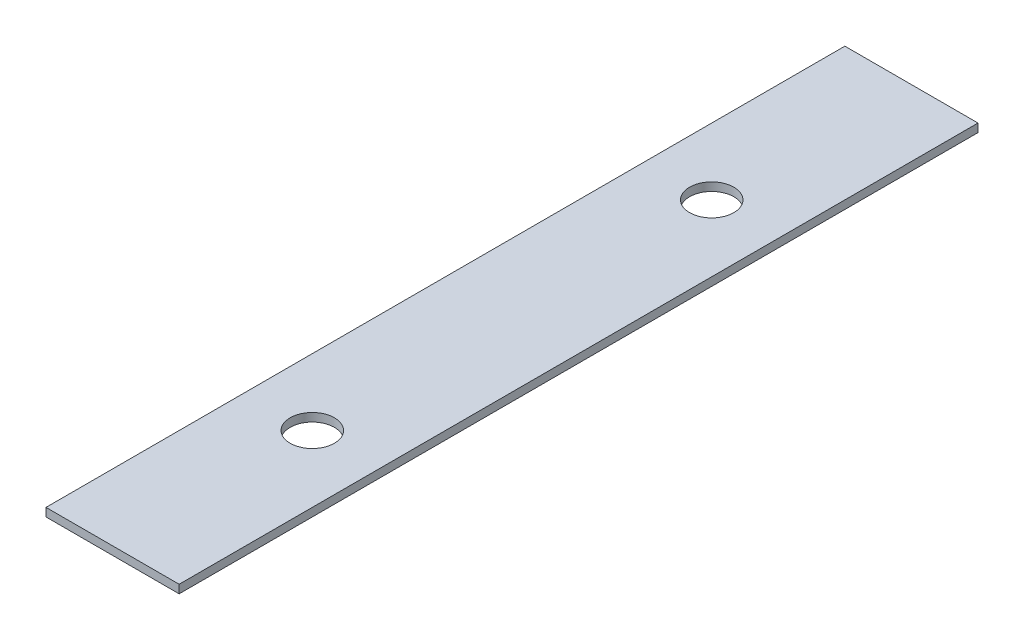
ISO-10303-21;
HEADER;
FILE_DESCRIPTION(('STEP AP214'),'2;1');
FILE_NAME('part.step','',(''),(''),'','','');
FILE_SCHEMA(('AUTOMOTIVE_DESIGN { 1 0 10303 214 1 1 1 1 }'));
ENDSEC;
DATA;
#1=APPLICATION_CONTEXT('core data for automotive mechanical design processes');
#2=APPLICATION_PROTOCOL_DEFINITION('international standard','automotive_design',2000,#1);
#3=PRODUCT_CONTEXT('',#1,'mechanical');
#4=PRODUCT('Part','Part','',(#3));
#5=PRODUCT_RELATED_PRODUCT_CATEGORY('part','',(#4));
#6=PRODUCT_DEFINITION_FORMATION('','',#4);
#7=PRODUCT_DEFINITION_CONTEXT('part definition',#1,'design');
#8=PRODUCT_DEFINITION('design','',#6,#7);
#9=PRODUCT_DEFINITION_SHAPE('','',#8);
#10=(LENGTH_UNIT() NAMED_UNIT(*) SI_UNIT(.MILLI.,.METRE.));
#11=(NAMED_UNIT(*) PLANE_ANGLE_UNIT() SI_UNIT($,.RADIAN.));
#12=(NAMED_UNIT(*) SI_UNIT($,.STERADIAN.) SOLID_ANGLE_UNIT());
#13=UNCERTAINTY_MEASURE_WITH_UNIT(LENGTH_MEASURE(1.E-05),#10,'distance_accuracy_value','');
#14=(GEOMETRIC_REPRESENTATION_CONTEXT(3) GLOBAL_UNCERTAINTY_ASSIGNED_CONTEXT((#13)) GLOBAL_UNIT_ASSIGNED_CONTEXT((#10,
#11,#12)) REPRESENTATION_CONTEXT('',''));
#15=CARTESIAN_POINT('',(0.,0.,0.));
#16=DIRECTION('',(0.,0.,1.));
#17=DIRECTION('',(1.,0.,0.));
#18=AXIS2_PLACEMENT_3D('',#15,#16,#17);
#19=CARTESIAN_POINT('',(0.,1.5875,0.));
#20=DIRECTION('',(1.,0.,0.));
#21=DIRECTION('',(0.,0.,-1.));
#22=AXIS2_PLACEMENT_3D('',#19,#20,#21);
#23=PLANE('',#22);
#24=DIRECTION('',(0.,0.,1.));
#25=VECTOR('',#24,1.);
#26=CARTESIAN_POINT('',(0.,0.,0.));
#27=LINE('',#26,#25);
#28=CARTESIAN_POINT('',(0.,0.,-152.4));
#29=VERTEX_POINT('',#28);
#30=CARTESIAN_POINT('',(0.,0.,0.));
#31=VERTEX_POINT('',#30);
#32=EDGE_CURVE('E110',#29,#31,#27,.T.);
#33=ORIENTED_EDGE('',*,*,#32,.T.);
#34=DIRECTION('',(0.,-1.,0.));
#35=VECTOR('',#34,1.);
#36=CARTESIAN_POINT('',(0.,1.5875,0.));
#37=LINE('',#36,#35);
#38=CARTESIAN_POINT('',(0.,1.5875,0.));
#39=VERTEX_POINT('',#38);
#40=EDGE_CURVE('E13',#39,#31,#37,.T.);
#41=ORIENTED_EDGE('',*,*,#40,.F.);
#42=DIRECTION('',(0.,0.,1.));
#43=VECTOR('',#42,1.);
#44=CARTESIAN_POINT('',(0.,1.5875,0.));
#45=LINE('',#44,#43);
#46=CARTESIAN_POINT('',(0.,1.5875,-152.4));
#47=VERTEX_POINT('',#46);
#48=EDGE_CURVE('E98',#47,#39,#45,.T.);
#49=ORIENTED_EDGE('',*,*,#48,.F.);
#50=DIRECTION('',(0.,-1.,0.));
#51=VECTOR('',#50,1.);
#52=CARTESIAN_POINT('',(0.,1.5875,-152.4));
#53=LINE('',#52,#51);
#54=EDGE_CURVE('E106',#47,#29,#53,.T.);
#55=ORIENTED_EDGE('',*,*,#54,.T.);
#56=EDGE_LOOP('',(#33,#41,#49,#55));
#57=FACE_BOUND('',#56,.T.);
#58=ADVANCED_FACE('F47',(#57),#23,.F.);
#59=CARTESIAN_POINT('',(0.,1.5875,0.));
#60=DIRECTION('',(0.,0.,-1.));
#61=DIRECTION('',(-1.,0.,0.));
#62=AXIS2_PLACEMENT_3D('',#59,#60,#61);
#63=PLANE('',#62);
#64=DIRECTION('',(1.,0.,0.));
#65=VECTOR('',#64,1.);
#66=CARTESIAN_POINT('',(0.,0.,0.));
#67=LINE('',#66,#65);
#68=CARTESIAN_POINT('',(25.4,0.,0.));
#69=VERTEX_POINT('',#68);
#70=EDGE_CURVE('E102',#31,#69,#67,.T.);
#71=ORIENTED_EDGE('',*,*,#70,.T.);
#72=DIRECTION('',(0.,-1.,0.));
#73=VECTOR('',#72,1.);
#74=CARTESIAN_POINT('',(25.4,1.5875,0.));
#75=LINE('',#74,#73);
#76=CARTESIAN_POINT('',(25.4,1.5875,0.));
#77=VERTEX_POINT('',#76);
#78=EDGE_CURVE('E55',#77,#69,#75,.T.);
#79=ORIENTED_EDGE('',*,*,#78,.F.);
#80=DIRECTION('',(1.,0.,0.));
#81=VECTOR('',#80,1.);
#82=CARTESIAN_POINT('',(0.,1.5875,0.));
#83=LINE('',#82,#81);
#84=EDGE_CURVE('E93',#39,#77,#83,.T.);
#85=ORIENTED_EDGE('',*,*,#84,.F.);
#86=ORIENTED_EDGE('',*,*,#40,.T.);
#87=EDGE_LOOP('',(#71,#79,#85,#86));
#88=FACE_BOUND('',#87,.T.);
#89=ADVANCED_FACE('F101',(#88),#63,.F.);
#90=CARTESIAN_POINT('',(25.4,1.5875,0.));
#91=DIRECTION('',(-1.,0.,0.));
#92=DIRECTION('',(0.,0.,1.));
#93=AXIS2_PLACEMENT_3D('',#90,#91,#92);
#94=PLANE('',#93);
#95=DIRECTION('',(0.,0.,-1.));
#96=VECTOR('',#95,1.);
#97=CARTESIAN_POINT('',(25.4,0.,0.));
#98=LINE('',#97,#96);
#99=CARTESIAN_POINT('',(25.4,0.,-152.4));
#100=VERTEX_POINT('',#99);
#101=EDGE_CURVE('E80',#69,#100,#98,.T.);
#102=ORIENTED_EDGE('',*,*,#101,.T.);
#103=DIRECTION('',(0.,-1.,0.));
#104=VECTOR('',#103,1.);
#105=CARTESIAN_POINT('',(25.4,1.5875,-152.4));
#106=LINE('',#105,#104);
#107=CARTESIAN_POINT('',(25.4,1.5875,-152.4));
#108=VERTEX_POINT('',#107);
#109=EDGE_CURVE('E103',#108,#100,#106,.T.);
#110=ORIENTED_EDGE('',*,*,#109,.F.);
#111=DIRECTION('',(0.,0.,-1.));
#112=VECTOR('',#111,1.);
#113=CARTESIAN_POINT('',(25.4,1.5875,0.));
#114=LINE('',#113,#112);
#115=EDGE_CURVE('E96',#77,#108,#114,.T.);
#116=ORIENTED_EDGE('',*,*,#115,.F.);
#117=ORIENTED_EDGE('',*,*,#78,.T.);
#118=EDGE_LOOP('',(#102,#110,#116,#117));
#119=FACE_BOUND('',#118,.T.);
#120=ADVANCED_FACE('F104',(#119),#94,.F.);
#121=CARTESIAN_POINT('',(0.,1.5875,-152.4));
#122=DIRECTION('',(0.,0.,1.));
#123=DIRECTION('',(1.,0.,0.));
#124=AXIS2_PLACEMENT_3D('',#121,#122,#123);
#125=PLANE('',#124);
#126=DIRECTION('',(-1.,0.,0.));
#127=VECTOR('',#126,1.);
#128=CARTESIAN_POINT('',(0.,0.,-152.4));
#129=LINE('',#128,#127);
#130=EDGE_CURVE('E86',#100,#29,#129,.T.);
#131=ORIENTED_EDGE('',*,*,#130,.T.);
#132=ORIENTED_EDGE('',*,*,#54,.F.);
#133=DIRECTION('',(-1.,0.,0.));
#134=VECTOR('',#133,1.);
#135=CARTESIAN_POINT('',(0.,1.5875,-152.4));
#136=LINE('',#135,#134);
#137=EDGE_CURVE('E63',#108,#47,#136,.T.);
#138=ORIENTED_EDGE('',*,*,#137,.F.);
#139=ORIENTED_EDGE('',*,*,#109,.T.);
#140=EDGE_LOOP('',(#131,#132,#138,#139));
#141=FACE_BOUND('',#140,.T.);
#142=ADVANCED_FACE('F118',(#141),#125,.F.);
#143=CARTESIAN_POINT('',(0.,1.5875,0.));
#144=DIRECTION('',(0.,-1.,0.));
#145=DIRECTION('',(0.,0.,-1.));
#146=AXIS2_PLACEMENT_3D('',#143,#144,#145);
#147=PLANE('',#146);
#148=CARTESIAN_POINT('',(12.7,1.5875,-114.3));
#149=DIRECTION('',(0.,1.,0.));
#150=DIRECTION('',(0.,0.,1.));
#151=AXIS2_PLACEMENT_3D('',#148,#149,#150);
#152=CIRCLE('',#151,4.21639999999999);
#153=CARTESIAN_POINT('',(12.7,1.5875,-110.0836));
#154=VERTEX_POINT('',#153);
#155=EDGE_CURVE('E132',#154,#154,#152,.T.);
#156=ORIENTED_EDGE('',*,*,#155,.F.);
#157=EDGE_LOOP('',(#156));
#158=FACE_BOUND('',#157,.T.);
#159=CARTESIAN_POINT('',(12.7,1.5875,-38.1));
#160=DIRECTION('',(0.,1.,0.));
#161=DIRECTION('',(0.,0.,1.));
#162=AXIS2_PLACEMENT_3D('',#159,#160,#161);
#163=CIRCLE('',#162,4.21639999999999);
#164=CARTESIAN_POINT('',(12.7,1.5875,-33.8836));
#165=VERTEX_POINT('',#164);
#166=EDGE_CURVE('E126',#165,#165,#163,.T.);
#167=ORIENTED_EDGE('',*,*,#166,.F.);
#168=EDGE_LOOP('',(#167));
#169=FACE_BOUND('',#168,.T.);
#170=ORIENTED_EDGE('',*,*,#48,.T.);
#171=ORIENTED_EDGE('',*,*,#84,.T.);
#172=ORIENTED_EDGE('',*,*,#115,.T.);
#173=ORIENTED_EDGE('',*,*,#137,.T.);
#174=EDGE_LOOP('',(#170,#171,#172,#173));
#175=FACE_BOUND('',#174,.T.);
#176=ADVANCED_FACE('F94',(#158,#169,#175),#147,.F.);
#177=CARTESIAN_POINT('',(0.,0.,0.));
#178=DIRECTION('',(0.,-1.,0.));
#179=DIRECTION('',(0.,0.,-1.));
#180=AXIS2_PLACEMENT_3D('',#177,#178,#179);
#181=PLANE('',#180);
#182=CARTESIAN_POINT('',(12.7,0.,-114.3));
#183=DIRECTION('',(0.,1.,0.));
#184=DIRECTION('',(0.,0.,1.));
#185=AXIS2_PLACEMENT_3D('',#182,#183,#184);
#186=CIRCLE('',#185,4.2164);
#187=CARTESIAN_POINT('',(12.7,0.,-110.0836));
#188=VERTEX_POINT('',#187);
#189=EDGE_CURVE('E129',#188,#188,#186,.T.);
#190=ORIENTED_EDGE('',*,*,#189,.T.);
#191=EDGE_LOOP('',(#190));
#192=FACE_BOUND('',#191,.T.);
#193=CARTESIAN_POINT('',(12.7,0.,-38.1));
#194=DIRECTION('',(0.,1.,0.));
#195=DIRECTION('',(0.,0.,1.));
#196=AXIS2_PLACEMENT_3D('',#193,#194,#195);
#197=CIRCLE('',#196,4.2164);
#198=CARTESIAN_POINT('',(12.7,0.,-33.8836));
#199=VERTEX_POINT('',#198);
#200=EDGE_CURVE('E113',#199,#199,#197,.T.);
#201=ORIENTED_EDGE('',*,*,#200,.T.);
#202=EDGE_LOOP('',(#201));
#203=FACE_BOUND('',#202,.T.);
#204=ORIENTED_EDGE('',*,*,#32,.F.);
#205=ORIENTED_EDGE('',*,*,#130,.F.);
#206=ORIENTED_EDGE('',*,*,#101,.F.);
#207=ORIENTED_EDGE('',*,*,#70,.F.);
#208=EDGE_LOOP('',(#204,#205,#206,#207));
#209=FACE_BOUND('',#208,.T.);
#210=ADVANCED_FACE('F121',(#192,#203,#209),#181,.T.);
#211=CARTESIAN_POINT('',(12.7,1.5875,-38.1));
#212=DIRECTION('',(0.,1.,0.));
#213=DIRECTION('',(0.,0.,1.));
#214=AXIS2_PLACEMENT_3D('',#211,#212,#213);
#215=CYLINDRICAL_SURFACE('',#214,4.21639999999999);
#216=ORIENTED_EDGE('',*,*,#200,.F.);
#217=EDGE_LOOP('',(#216));
#218=FACE_BOUND('',#217,.T.);
#219=ORIENTED_EDGE('',*,*,#166,.T.);
#220=EDGE_LOOP('',(#219));
#221=FACE_BOUND('',#220,.T.);
#222=ADVANCED_FACE('F143',(#218,#221),#215,.F.);
#223=CARTESIAN_POINT('',(12.7,1.5875,-114.3));
#224=DIRECTION('',(0.,1.,0.));
#225=DIRECTION('',(0.,0.,1.));
#226=AXIS2_PLACEMENT_3D('',#223,#224,#225);
#227=CYLINDRICAL_SURFACE('',#226,4.21639999999999);
#228=ORIENTED_EDGE('',*,*,#189,.F.);
#229=EDGE_LOOP('',(#228));
#230=FACE_BOUND('',#229,.T.);
#231=ORIENTED_EDGE('',*,*,#155,.T.);
#232=EDGE_LOOP('',(#231));
#233=FACE_BOUND('',#232,.T.);
#234=ADVANCED_FACE('F136',(#230,#233),#227,.F.);
#235=CLOSED_SHELL('',(#58,#89,#120,#142,#176,#210,#222,#234));
#236=MANIFOLD_SOLID_BREP('B2',#235);
#237=ADVANCED_BREP_SHAPE_REPRESENTATION('',(#18,#236),#14);
#238=SHAPE_DEFINITION_REPRESENTATION(#9,#237);
ENDSEC;
END-ISO-10303-21;
